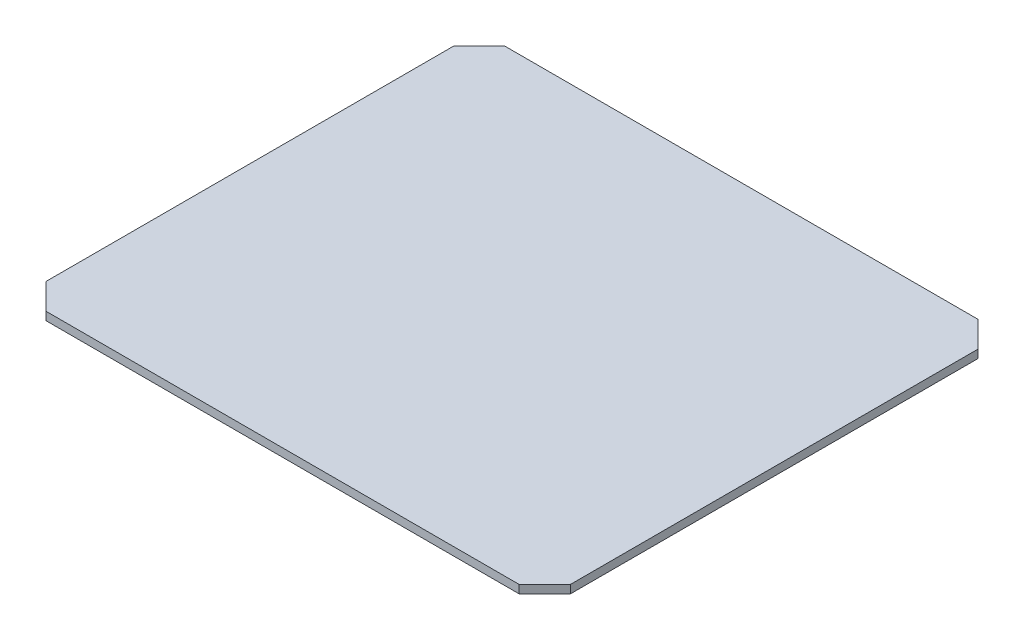
ISO-10303-21;
HEADER;
FILE_DESCRIPTION(('STEP AP214'),'2;1');
FILE_NAME('part.step','',(''),(''),'','','');
FILE_SCHEMA(('AUTOMOTIVE_DESIGN { 1 0 10303 214 1 1 1 1 }'));
ENDSEC;
DATA;
#1=APPLICATION_CONTEXT('core data for automotive mechanical design processes');
#2=APPLICATION_PROTOCOL_DEFINITION('international standard','automotive_design',2000,#1);
#3=PRODUCT_CONTEXT('',#1,'mechanical');
#4=PRODUCT('Part','Part','',(#3));
#5=PRODUCT_RELATED_PRODUCT_CATEGORY('part','',(#4));
#6=PRODUCT_DEFINITION_FORMATION('','',#4);
#7=PRODUCT_DEFINITION_CONTEXT('part definition',#1,'design');
#8=PRODUCT_DEFINITION('design','',#6,#7);
#9=PRODUCT_DEFINITION_SHAPE('','',#8);
#10=(LENGTH_UNIT() NAMED_UNIT(*) SI_UNIT(.MILLI.,.METRE.));
#11=(NAMED_UNIT(*) PLANE_ANGLE_UNIT() SI_UNIT($,.RADIAN.));
#12=(NAMED_UNIT(*) SI_UNIT($,.STERADIAN.) SOLID_ANGLE_UNIT());
#13=UNCERTAINTY_MEASURE_WITH_UNIT(LENGTH_MEASURE(1.E-05),#10,'distance_accuracy_value','');
#14=(GEOMETRIC_REPRESENTATION_CONTEXT(3) GLOBAL_UNCERTAINTY_ASSIGNED_CONTEXT((#13)) GLOBAL_UNIT_ASSIGNED_CONTEXT((#10,
#11,#12)) REPRESENTATION_CONTEXT('',''));
#15=CARTESIAN_POINT('',(0.,0.,0.));
#16=DIRECTION('',(0.,0.,1.));
#17=DIRECTION('',(1.,0.,0.));
#18=AXIS2_PLACEMENT_3D('',#15,#16,#17);
#19=CARTESIAN_POINT('',(101.6,3.175,-88.9));
#20=DIRECTION('',(-1.,0.,0.));
#21=DIRECTION('',(0.,0.,1.));
#22=AXIS2_PLACEMENT_3D('',#19,#20,#21);
#23=PLANE('',#22);
#24=DIRECTION('',(0.,0.,-1.));
#25=VECTOR('',#24,1.);
#26=CARTESIAN_POINT('',(101.6,0.,-88.9));
#27=LINE('',#26,#25);
#28=CARTESIAN_POINT('',(101.6,0.,78.9));
#29=VERTEX_POINT('',#28);
#30=CARTESIAN_POINT('',(101.6,0.,-78.9));
#31=VERTEX_POINT('',#30);
#32=EDGE_CURVE('E130',#29,#31,#27,.T.);
#33=ORIENTED_EDGE('',*,*,#32,.T.);
#34=DIRECTION('',(0.,1.,0.));
#35=VECTOR('',#34,1.);
#36=CARTESIAN_POINT('',(101.6,3.175,-78.9));
#37=LINE('',#36,#35);
#38=CARTESIAN_POINT('',(101.6,3.175,-78.9));
#39=VERTEX_POINT('',#38);
#40=EDGE_CURVE('E153',#31,#39,#37,.T.);
#41=ORIENTED_EDGE('',*,*,#40,.T.);
#42=DIRECTION('',(0.,0.,-1.));
#43=VECTOR('',#42,1.);
#44=CARTESIAN_POINT('',(101.6,3.175,-88.9));
#45=LINE('',#44,#43);
#46=CARTESIAN_POINT('',(101.6,3.175,78.9));
#47=VERTEX_POINT('',#46);
#48=EDGE_CURVE('E128',#47,#39,#45,.T.);
#49=ORIENTED_EDGE('',*,*,#48,.F.);
#50=DIRECTION('',(0.,-1.,0.));
#51=VECTOR('',#50,1.);
#52=CARTESIAN_POINT('',(101.6,3.175,78.9));
#53=LINE('',#52,#51);
#54=EDGE_CURVE('E150',#47,#29,#53,.T.);
#55=ORIENTED_EDGE('',*,*,#54,.T.);
#56=EDGE_LOOP('',(#33,#41,#49,#55));
#57=FACE_BOUND('',#56,.T.);
#58=ADVANCED_FACE('F35',(#57),#23,.F.);
#59=CARTESIAN_POINT('',(-101.6,3.175,-88.9));
#60=DIRECTION('',(0.,0.,1.));
#61=DIRECTION('',(1.,0.,0.));
#62=AXIS2_PLACEMENT_3D('',#59,#60,#61);
#63=PLANE('',#62);
#64=DIRECTION('',(-1.,0.,0.));
#65=VECTOR('',#64,1.);
#66=CARTESIAN_POINT('',(-101.6,0.,-88.9));
#67=LINE('',#66,#65);
#68=CARTESIAN_POINT('',(91.6,0.,-88.9));
#69=VERTEX_POINT('',#68);
#70=CARTESIAN_POINT('',(-91.6,0.,-88.9));
#71=VERTEX_POINT('',#70);
#72=EDGE_CURVE('E126',#69,#71,#67,.T.);
#73=ORIENTED_EDGE('',*,*,#72,.T.);
#74=DIRECTION('',(0.,1.,0.));
#75=VECTOR('',#74,1.);
#76=CARTESIAN_POINT('',(-91.6,3.175,-88.9));
#77=LINE('',#76,#75);
#78=CARTESIAN_POINT('',(-91.6,3.175,-88.9));
#79=VERTEX_POINT('',#78);
#80=EDGE_CURVE('E105',#71,#79,#77,.T.);
#81=ORIENTED_EDGE('',*,*,#80,.T.);
#82=DIRECTION('',(-1.,0.,0.));
#83=VECTOR('',#82,1.);
#84=CARTESIAN_POINT('',(-101.6,3.175,-88.9));
#85=LINE('',#84,#83);
#86=CARTESIAN_POINT('',(91.6,3.175,-88.9));
#87=VERTEX_POINT('',#86);
#88=EDGE_CURVE('E169',#87,#79,#85,.T.);
#89=ORIENTED_EDGE('',*,*,#88,.F.);
#90=DIRECTION('',(0.,-1.,0.));
#91=VECTOR('',#90,1.);
#92=CARTESIAN_POINT('',(91.6,3.175,-88.9));
#93=LINE('',#92,#91);
#94=EDGE_CURVE('E110',#87,#69,#93,.T.);
#95=ORIENTED_EDGE('',*,*,#94,.T.);
#96=EDGE_LOOP('',(#73,#81,#89,#95));
#97=FACE_BOUND('',#96,.T.);
#98=ADVANCED_FACE('F186',(#97),#63,.F.);
#99=CARTESIAN_POINT('',(-101.6,3.175,-88.9));
#100=DIRECTION('',(1.,0.,0.));
#101=DIRECTION('',(0.,0.,-1.));
#102=AXIS2_PLACEMENT_3D('',#99,#100,#101);
#103=PLANE('',#102);
#104=DIRECTION('',(0.,0.,1.));
#105=VECTOR('',#104,1.);
#106=CARTESIAN_POINT('',(-101.6,3.175,-88.9));
#107=LINE('',#106,#105);
#108=CARTESIAN_POINT('',(-101.6,3.175,-78.9));
#109=VERTEX_POINT('',#108);
#110=CARTESIAN_POINT('',(-101.6,3.175,78.9));
#111=VERTEX_POINT('',#110);
#112=EDGE_CURVE('E119',#109,#111,#107,.T.);
#113=ORIENTED_EDGE('',*,*,#112,.F.);
#114=DIRECTION('',(0.,-1.,0.));
#115=VECTOR('',#114,1.);
#116=CARTESIAN_POINT('',(-101.6,3.175,-78.9));
#117=LINE('',#116,#115);
#118=CARTESIAN_POINT('',(-101.6,0.,-78.9));
#119=VERTEX_POINT('',#118);
#120=EDGE_CURVE('E104',#109,#119,#117,.T.);
#121=ORIENTED_EDGE('',*,*,#120,.T.);
#122=DIRECTION('',(0.,0.,1.));
#123=VECTOR('',#122,1.);
#124=CARTESIAN_POINT('',(-101.6,0.,-88.9));
#125=LINE('',#124,#123);
#126=CARTESIAN_POINT('',(-101.6,0.,78.9));
#127=VERTEX_POINT('',#126);
#128=EDGE_CURVE('E117',#119,#127,#125,.T.);
#129=ORIENTED_EDGE('',*,*,#128,.T.);
#130=DIRECTION('',(0.,1.,0.));
#131=VECTOR('',#130,1.);
#132=CARTESIAN_POINT('',(-101.6,3.175,78.9));
#133=LINE('',#132,#131);
#134=EDGE_CURVE('E121',#127,#111,#133,.T.);
#135=ORIENTED_EDGE('',*,*,#134,.T.);
#136=EDGE_LOOP('',(#113,#121,#129,#135));
#137=FACE_BOUND('',#136,.T.);
#138=ADVANCED_FACE('F116',(#137),#103,.F.);
#139=CARTESIAN_POINT('',(-101.6,3.175,88.9));
#140=DIRECTION('',(0.,0.,-1.));
#141=DIRECTION('',(-1.,0.,0.));
#142=AXIS2_PLACEMENT_3D('',#139,#140,#141);
#143=PLANE('',#142);
#144=DIRECTION('',(1.,0.,0.));
#145=VECTOR('',#144,1.);
#146=CARTESIAN_POINT('',(-101.6,0.,88.9));
#147=LINE('',#146,#145);
#148=CARTESIAN_POINT('',(-91.6,0.,88.9));
#149=VERTEX_POINT('',#148);
#150=CARTESIAN_POINT('',(91.6,0.,88.9));
#151=VERTEX_POINT('',#150);
#152=EDGE_CURVE('E125',#149,#151,#147,.T.);
#153=ORIENTED_EDGE('',*,*,#152,.T.);
#154=DIRECTION('',(0.,1.,0.));
#155=VECTOR('',#154,1.);
#156=CARTESIAN_POINT('',(91.6,3.175,88.9));
#157=LINE('',#156,#155);
#158=CARTESIAN_POINT('',(91.6,3.175,88.9));
#159=VERTEX_POINT('',#158);
#160=EDGE_CURVE('E11',#151,#159,#157,.T.);
#161=ORIENTED_EDGE('',*,*,#160,.T.);
#162=DIRECTION('',(1.,0.,0.));
#163=VECTOR('',#162,1.);
#164=CARTESIAN_POINT('',(-101.6,3.175,88.9));
#165=LINE('',#164,#163);
#166=CARTESIAN_POINT('',(-91.6,3.175,88.9));
#167=VERTEX_POINT('',#166);
#168=EDGE_CURVE('E134',#167,#159,#165,.T.);
#169=ORIENTED_EDGE('',*,*,#168,.F.);
#170=DIRECTION('',(0.,-1.,0.));
#171=VECTOR('',#170,1.);
#172=CARTESIAN_POINT('',(-91.6,3.175,88.9));
#173=LINE('',#172,#171);
#174=EDGE_CURVE('E43',#167,#149,#173,.T.);
#175=ORIENTED_EDGE('',*,*,#174,.T.);
#176=EDGE_LOOP('',(#153,#161,#169,#175));
#177=FACE_BOUND('',#176,.T.);
#178=ADVANCED_FACE('F156',(#177),#143,.F.);
#179=CARTESIAN_POINT('',(0.,3.175,0.));
#180=DIRECTION('',(0.,1.,0.));
#181=DIRECTION('',(0.,0.,1.));
#182=AXIS2_PLACEMENT_3D('',#179,#180,#181);
#183=PLANE('',#182);
#184=ORIENTED_EDGE('',*,*,#88,.T.);
#185=DIRECTION('',(0.707106781186548,0.,-0.707106781186547));
#186=VECTOR('',#185,1.);
#187=CARTESIAN_POINT('',(-90.2499999999999,3.175,-90.2500000000001));
#188=LINE('',#187,#186);
#189=EDGE_CURVE('E148',#79,#109,#188,.F.);
#190=ORIENTED_EDGE('',*,*,#189,.T.);
#191=ORIENTED_EDGE('',*,*,#112,.T.);
#192=DIRECTION('',(-0.707106781186547,0.,-0.707106781186549));
#193=VECTOR('',#192,1.);
#194=CARTESIAN_POINT('',(-90.2500000000001,3.175,90.2499999999999));
#195=LINE('',#194,#193);
#196=EDGE_CURVE('E55',#111,#167,#195,.F.);
#197=ORIENTED_EDGE('',*,*,#196,.T.);
#198=ORIENTED_EDGE('',*,*,#168,.T.);
#199=DIRECTION('',(-0.70710678118655,0.,0.707106781186546));
#200=VECTOR('',#199,1.);
#201=CARTESIAN_POINT('',(90.2499999999997,3.175,90.2500000000002));
#202=LINE('',#201,#200);
#203=EDGE_CURVE('E144',#159,#47,#202,.F.);
#204=ORIENTED_EDGE('',*,*,#203,.T.);
#205=ORIENTED_EDGE('',*,*,#48,.T.);
#206=DIRECTION('',(0.707106781186547,0.,0.707106781186549));
#207=VECTOR('',#206,1.);
#208=CARTESIAN_POINT('',(90.2500000000001,3.175,-90.2499999999999));
#209=LINE('',#208,#207);
#210=EDGE_CURVE('E146',#39,#87,#209,.F.);
#211=ORIENTED_EDGE('',*,*,#210,.T.);
#212=EDGE_LOOP('',(#184,#190,#191,#197,#198,#204,#205,#211));
#213=FACE_BOUND('',#212,.T.);
#214=ADVANCED_FACE('F175',(#213),#183,.T.);
#215=CARTESIAN_POINT('',(0.,0.,0.));
#216=DIRECTION('',(0.,1.,0.));
#217=DIRECTION('',(0.,0.,1.));
#218=AXIS2_PLACEMENT_3D('',#215,#216,#217);
#219=PLANE('',#218);
#220=ORIENTED_EDGE('',*,*,#128,.F.);
#221=DIRECTION('',(-0.707106781186548,0.,0.707106781186547));
#222=VECTOR('',#221,1.);
#223=CARTESIAN_POINT('',(-101.6,0.,-78.9));
#224=LINE('',#223,#222);
#225=EDGE_CURVE('E100',#119,#71,#224,.F.);
#226=ORIENTED_EDGE('',*,*,#225,.T.);
#227=ORIENTED_EDGE('',*,*,#72,.F.);
#228=DIRECTION('',(-0.707106781186547,0.,-0.707106781186549));
#229=VECTOR('',#228,1.);
#230=CARTESIAN_POINT('',(91.6,0.,-88.9));
#231=LINE('',#230,#229);
#232=EDGE_CURVE('E111',#69,#31,#231,.F.);
#233=ORIENTED_EDGE('',*,*,#232,.T.);
#234=ORIENTED_EDGE('',*,*,#32,.F.);
#235=DIRECTION('',(0.70710678118655,0.,-0.707106781186546));
#236=VECTOR('',#235,1.);
#237=CARTESIAN_POINT('',(101.6,0.,78.9));
#238=LINE('',#237,#236);
#239=EDGE_CURVE('E137',#29,#151,#238,.F.);
#240=ORIENTED_EDGE('',*,*,#239,.T.);
#241=ORIENTED_EDGE('',*,*,#152,.F.);
#242=DIRECTION('',(0.707106781186547,0.,0.707106781186549));
#243=VECTOR('',#242,1.);
#244=CARTESIAN_POINT('',(-91.6,0.,88.9));
#245=LINE('',#244,#243);
#246=EDGE_CURVE('E120',#149,#127,#245,.F.);
#247=ORIENTED_EDGE('',*,*,#246,.T.);
#248=EDGE_LOOP('',(#220,#226,#227,#233,#234,#240,#241,#247));
#249=FACE_BOUND('',#248,.T.);
#250=ADVANCED_FACE('F123',(#249),#219,.F.);
#251=CARTESIAN_POINT('',(-101.6,3.175,-78.9));
#252=DIRECTION('',(0.707106781186547,0.,0.707106781186548));
#253=DIRECTION('',(0.,-1.,0.));
#254=AXIS2_PLACEMENT_3D('',#251,#252,#253);
#255=PLANE('',#254);
#256=ORIENTED_EDGE('',*,*,#189,.F.);
#257=ORIENTED_EDGE('',*,*,#80,.F.);
#258=ORIENTED_EDGE('',*,*,#225,.F.);
#259=ORIENTED_EDGE('',*,*,#120,.F.);
#260=EDGE_LOOP('',(#256,#257,#258,#259));
#261=FACE_BOUND('',#260,.T.);
#262=ADVANCED_FACE('F103',(#261),#255,.F.);
#263=CARTESIAN_POINT('',(91.6,3.175,-88.9));
#264=DIRECTION('',(-0.707106781186548,0.,0.707106781186546));
#265=DIRECTION('',(0.,-1.,0.));
#266=AXIS2_PLACEMENT_3D('',#263,#264,#265);
#267=PLANE('',#266);
#268=ORIENTED_EDGE('',*,*,#210,.F.);
#269=ORIENTED_EDGE('',*,*,#40,.F.);
#270=ORIENTED_EDGE('',*,*,#232,.F.);
#271=ORIENTED_EDGE('',*,*,#94,.F.);
#272=EDGE_LOOP('',(#268,#269,#270,#271));
#273=FACE_BOUND('',#272,.T.);
#274=ADVANCED_FACE('F197',(#273),#267,.F.);
#275=CARTESIAN_POINT('',(101.6,3.175,78.9));
#276=DIRECTION('',(-0.707106781186545,0.,-0.707106781186549));
#277=DIRECTION('',(0.,-1.,0.));
#278=AXIS2_PLACEMENT_3D('',#275,#276,#277);
#279=PLANE('',#278);
#280=ORIENTED_EDGE('',*,*,#203,.F.);
#281=ORIENTED_EDGE('',*,*,#160,.F.);
#282=ORIENTED_EDGE('',*,*,#239,.F.);
#283=ORIENTED_EDGE('',*,*,#54,.F.);
#284=EDGE_LOOP('',(#280,#281,#282,#283));
#285=FACE_BOUND('',#284,.T.);
#286=ADVANCED_FACE('F163',(#285),#279,.F.);
#287=CARTESIAN_POINT('',(-91.6,3.175,88.9));
#288=DIRECTION('',(0.707106781186548,0.,-0.707106781186546));
#289=DIRECTION('',(0.,-1.,0.));
#290=AXIS2_PLACEMENT_3D('',#287,#288,#289);
#291=PLANE('',#290);
#292=ORIENTED_EDGE('',*,*,#196,.F.);
#293=ORIENTED_EDGE('',*,*,#134,.F.);
#294=ORIENTED_EDGE('',*,*,#246,.F.);
#295=ORIENTED_EDGE('',*,*,#174,.F.);
#296=EDGE_LOOP('',(#292,#293,#294,#295));
#297=FACE_BOUND('',#296,.T.);
#298=ADVANCED_FACE('F37',(#297),#291,.F.);
#299=CLOSED_SHELL('',(#58,#98,#138,#178,#214,#250,#262,#274,#286,#298));
#300=MANIFOLD_SOLID_BREP('B2',#299);
#301=ADVANCED_BREP_SHAPE_REPRESENTATION('',(#18,#300),#14);
#302=SHAPE_DEFINITION_REPRESENTATION(#9,#301);
ENDSEC;
END-ISO-10303-21;
